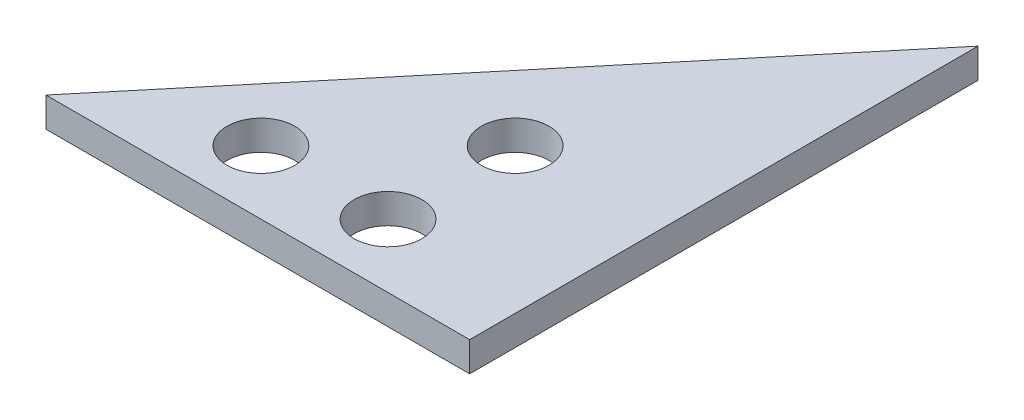
ISO-10303-21;
HEADER;
FILE_DESCRIPTION(('STEP AP214'),'2;1');
FILE_NAME('part.step','',(''),(''),'','','');
FILE_SCHEMA(('AUTOMOTIVE_DESIGN { 1 0 10303 214 1 1 1 1 }'));
ENDSEC;
DATA;
#1=APPLICATION_CONTEXT('core data for automotive mechanical design processes');
#2=APPLICATION_PROTOCOL_DEFINITION('international standard','automotive_design',2000,#1);
#3=PRODUCT_CONTEXT('',#1,'mechanical');
#4=PRODUCT('Part','Part','',(#3));
#5=PRODUCT_RELATED_PRODUCT_CATEGORY('part','',(#4));
#6=PRODUCT_DEFINITION_FORMATION('','',#4);
#7=PRODUCT_DEFINITION_CONTEXT('part definition',#1,'design');
#8=PRODUCT_DEFINITION('design','',#6,#7);
#9=PRODUCT_DEFINITION_SHAPE('','',#8);
#10=(LENGTH_UNIT() NAMED_UNIT(*) SI_UNIT(.MILLI.,.METRE.));
#11=(NAMED_UNIT(*) PLANE_ANGLE_UNIT() SI_UNIT($,.RADIAN.));
#12=(NAMED_UNIT(*) SI_UNIT($,.STERADIAN.) SOLID_ANGLE_UNIT());
#13=UNCERTAINTY_MEASURE_WITH_UNIT(LENGTH_MEASURE(1.E-05),#10,'distance_accuracy_value','');
#14=(GEOMETRIC_REPRESENTATION_CONTEXT(3) GLOBAL_UNCERTAINTY_ASSIGNED_CONTEXT((#13)) GLOBAL_UNIT_ASSIGNED_CONTEXT((#10,
#11,#12)) REPRESENTATION_CONTEXT('',''));
#15=CARTESIAN_POINT('',(0.,0.,0.));
#16=DIRECTION('',(0.,0.,1.));
#17=DIRECTION('',(1.,0.,0.));
#18=AXIS2_PLACEMENT_3D('',#15,#16,#17);
#19=CARTESIAN_POINT('',(47.2347331362598,3.5,-54.3243733430823));
#20=DIRECTION('',(0.768221279597376,0.,0.64018439966448));
#21=DIRECTION('',(0.64018439966448,0.,-0.768221279597376));
#22=AXIS2_PLACEMENT_3D('',#19,#20,#21);
#23=PLANE('',#22);
#24=DIRECTION('',(-0.64018439966448,0.,0.768221279597376));
#25=VECTOR('',#24,1.);
#26=CARTESIAN_POINT('',(47.2347331362598,0.,-54.3243733430823));
#27=LINE('',#26,#25);
#28=CARTESIAN_POINT('',(47.2347331362598,0.,-54.3243733430823));
#29=VERTEX_POINT('',#28);
#30=CARTESIAN_POINT('',(-2.76526686374022,0.,5.6756266569177));
#31=VERTEX_POINT('',#30);
#32=EDGE_CURVE('E84',#29,#31,#27,.T.);
#33=ORIENTED_EDGE('',*,*,#32,.T.);
#34=DIRECTION('',(0.,-1.,0.));
#35=VECTOR('',#34,1.);
#36=CARTESIAN_POINT('',(-2.76526686374022,3.5,5.6756266569177));
#37=LINE('',#36,#35);
#38=CARTESIAN_POINT('',(-2.76526686374022,3.5,5.6756266569177));
#39=VERTEX_POINT('',#38);
#40=EDGE_CURVE('E11',#39,#31,#37,.T.);
#41=ORIENTED_EDGE('',*,*,#40,.F.);
#42=DIRECTION('',(-0.64018439966448,0.,0.768221279597376));
#43=VECTOR('',#42,1.);
#44=CARTESIAN_POINT('',(47.2347331362598,3.5,-54.3243733430823));
#45=LINE('',#44,#43);
#46=CARTESIAN_POINT('',(47.2347331362598,3.5,-54.3243733430823));
#47=VERTEX_POINT('',#46);
#48=EDGE_CURVE('E77',#47,#39,#45,.T.);
#49=ORIENTED_EDGE('',*,*,#48,.F.);
#50=DIRECTION('',(0.,-1.,0.));
#51=VECTOR('',#50,1.);
#52=CARTESIAN_POINT('',(47.2347331362598,3.5,-54.3243733430823));
#53=LINE('',#52,#51);
#54=EDGE_CURVE('E85',#47,#29,#53,.T.);
#55=ORIENTED_EDGE('',*,*,#54,.T.);
#56=EDGE_LOOP('',(#33,#41,#49,#55));
#57=FACE_BOUND('',#56,.T.);
#58=ADVANCED_FACE('F37',(#57),#23,.F.);
#59=CARTESIAN_POINT('',(-2.76526686374022,3.5,5.6756266569177));
#60=DIRECTION('',(0.,0.,-1.));
#61=DIRECTION('',(-1.,0.,0.));
#62=AXIS2_PLACEMENT_3D('',#59,#60,#61);
#63=PLANE('',#62);
#64=DIRECTION('',(1.,0.,0.));
#65=VECTOR('',#64,1.);
#66=CARTESIAN_POINT('',(-2.76526686374022,0.,5.6756266569177));
#67=LINE('',#66,#65);
#68=CARTESIAN_POINT('',(47.2347331362598,0.,5.6756266569177));
#69=VERTEX_POINT('',#68);
#70=EDGE_CURVE('E65',#31,#69,#67,.T.);
#71=ORIENTED_EDGE('',*,*,#70,.T.);
#72=DIRECTION('',(0.,-1.,0.));
#73=VECTOR('',#72,1.);
#74=CARTESIAN_POINT('',(47.2347331362598,3.5,5.6756266569177));
#75=LINE('',#74,#73);
#76=CARTESIAN_POINT('',(47.2347331362598,3.5,5.6756266569177));
#77=VERTEX_POINT('',#76);
#78=EDGE_CURVE('E45',#77,#69,#75,.T.);
#79=ORIENTED_EDGE('',*,*,#78,.F.);
#80=DIRECTION('',(1.,0.,0.));
#81=VECTOR('',#80,1.);
#82=CARTESIAN_POINT('',(-2.76526686374022,3.5,5.6756266569177));
#83=LINE('',#82,#81);
#84=EDGE_CURVE('E73',#39,#77,#83,.T.);
#85=ORIENTED_EDGE('',*,*,#84,.F.);
#86=ORIENTED_EDGE('',*,*,#40,.T.);
#87=EDGE_LOOP('',(#71,#79,#85,#86));
#88=FACE_BOUND('',#87,.T.);
#89=ADVANCED_FACE('F74',(#88),#63,.F.);
#90=CARTESIAN_POINT('',(47.2347331362598,3.5,5.6756266569177));
#91=DIRECTION('',(-1.,0.,0.));
#92=DIRECTION('',(0.,0.,1.));
#93=AXIS2_PLACEMENT_3D('',#90,#91,#92);
#94=PLANE('',#93);
#95=DIRECTION('',(0.,0.,-1.));
#96=VECTOR('',#95,1.);
#97=CARTESIAN_POINT('',(47.2347331362598,0.,5.6756266569177));
#98=LINE('',#97,#96);
#99=EDGE_CURVE('E70',#69,#29,#98,.T.);
#100=ORIENTED_EDGE('',*,*,#99,.T.);
#101=ORIENTED_EDGE('',*,*,#54,.F.);
#102=DIRECTION('',(0.,0.,-1.));
#103=VECTOR('',#102,1.);
#104=CARTESIAN_POINT('',(47.2347331362598,3.5,5.6756266569177));
#105=LINE('',#104,#103);
#106=EDGE_CURVE('E53',#77,#47,#105,.T.);
#107=ORIENTED_EDGE('',*,*,#106,.F.);
#108=ORIENTED_EDGE('',*,*,#78,.T.);
#109=EDGE_LOOP('',(#100,#101,#107,#108));
#110=FACE_BOUND('',#109,.T.);
#111=ADVANCED_FACE('F96',(#110),#94,.F.);
#112=CARTESIAN_POINT('',(0.,3.5,0.));
#113=DIRECTION('',(0.,1.,0.));
#114=DIRECTION('',(0.,0.,1.));
#115=AXIS2_PLACEMENT_3D('',#112,#113,#114);
#116=PLANE('',#115);
#117=CARTESIAN_POINT('',(15.1019731362598,3.5,-1.8243733430823));
#118=DIRECTION('',(0.,1.,0.));
#119=DIRECTION('',(0.,0.,1.));
#120=AXIS2_PLACEMENT_3D('',#117,#118,#119);
#121=CIRCLE('',#120,4.);
#122=CARTESIAN_POINT('',(15.1019731362598,3.5,2.1756266569177));
#123=VERTEX_POINT('',#122);
#124=EDGE_CURVE('E191',#123,#123,#121,.T.);
#125=ORIENTED_EDGE('',*,*,#124,.F.);
#126=EDGE_LOOP('',(#125));
#127=FACE_BOUND('',#126,.T.);
#128=CARTESIAN_POINT('',(30.1019731362598,3.5,-16.8243733430823));
#129=DIRECTION('',(0.,1.,0.));
#130=DIRECTION('',(0.,0.,1.));
#131=AXIS2_PLACEMENT_3D('',#128,#129,#130);
#132=CIRCLE('',#131,4.00000000000001);
#133=CARTESIAN_POINT('',(30.1019731362598,3.5,-12.8243733430823));
#134=VERTEX_POINT('',#133);
#135=EDGE_CURVE('E195',#134,#134,#132,.T.);
#136=ORIENTED_EDGE('',*,*,#135,.F.);
#137=EDGE_LOOP('',(#136));
#138=FACE_BOUND('',#137,.T.);
#139=CARTESIAN_POINT('',(30.1019731362598,3.5,-1.8243733430823));
#140=DIRECTION('',(0.,1.,0.));
#141=DIRECTION('',(0.,0.,1.));
#142=AXIS2_PLACEMENT_3D('',#139,#140,#141);
#143=CIRCLE('',#142,4.00000000000001);
#144=CARTESIAN_POINT('',(30.1019731362598,3.5,2.17562665691771));
#145=VERTEX_POINT('',#144);
#146=EDGE_CURVE('E91',#145,#145,#143,.T.);
#147=ORIENTED_EDGE('',*,*,#146,.F.);
#148=EDGE_LOOP('',(#147));
#149=FACE_BOUND('',#148,.T.);
#150=ORIENTED_EDGE('',*,*,#48,.T.);
#151=ORIENTED_EDGE('',*,*,#84,.T.);
#152=ORIENTED_EDGE('',*,*,#106,.T.);
#153=EDGE_LOOP('',(#150,#151,#152));
#154=FACE_BOUND('',#153,.T.);
#155=ADVANCED_FACE('F80',(#127,#138,#149,#154),#116,.T.);
#156=CARTESIAN_POINT('',(0.,0.,0.));
#157=DIRECTION('',(0.,1.,0.));
#158=DIRECTION('',(0.,0.,1.));
#159=AXIS2_PLACEMENT_3D('',#156,#157,#158);
#160=PLANE('',#159);
#161=CARTESIAN_POINT('',(15.1019731362598,0.,-1.8243733430823));
#162=DIRECTION('',(0.,1.,0.));
#163=DIRECTION('',(0.,0.,1.));
#164=AXIS2_PLACEMENT_3D('',#161,#162,#163);
#165=CIRCLE('',#164,4.);
#166=CARTESIAN_POINT('',(15.1019731362598,0.,2.1756266569177));
#167=VERTEX_POINT('',#166);
#168=EDGE_CURVE('E188',#167,#167,#165,.F.);
#169=ORIENTED_EDGE('',*,*,#168,.F.);
#170=EDGE_LOOP('',(#169));
#171=FACE_BOUND('',#170,.T.);
#172=CARTESIAN_POINT('',(30.1019731362598,0.,-16.8243733430823));
#173=DIRECTION('',(0.,1.,0.));
#174=DIRECTION('',(0.,0.,1.));
#175=AXIS2_PLACEMENT_3D('',#172,#173,#174);
#176=CIRCLE('',#175,4.00000000000001);
#177=CARTESIAN_POINT('',(30.1019731362598,0.,-12.8243733430823));
#178=VERTEX_POINT('',#177);
#179=EDGE_CURVE('E192',#178,#178,#176,.F.);
#180=ORIENTED_EDGE('',*,*,#179,.F.);
#181=EDGE_LOOP('',(#180));
#182=FACE_BOUND('',#181,.T.);
#183=CARTESIAN_POINT('',(30.1019731362598,0.,-1.8243733430823));
#184=DIRECTION('',(0.,1.,0.));
#185=DIRECTION('',(0.,0.,1.));
#186=AXIS2_PLACEMENT_3D('',#183,#184,#185);
#187=CIRCLE('',#186,4.00000000000001);
#188=CARTESIAN_POINT('',(30.1019731362598,0.,2.17562665691771));
#189=VERTEX_POINT('',#188);
#190=EDGE_CURVE('E87',#189,#189,#187,.F.);
#191=ORIENTED_EDGE('',*,*,#190,.F.);
#192=EDGE_LOOP('',(#191));
#193=FACE_BOUND('',#192,.T.);
#194=ORIENTED_EDGE('',*,*,#32,.F.);
#195=ORIENTED_EDGE('',*,*,#99,.F.);
#196=ORIENTED_EDGE('',*,*,#70,.F.);
#197=EDGE_LOOP('',(#194,#195,#196));
#198=FACE_BOUND('',#197,.T.);
#199=ADVANCED_FACE('F97',(#171,#182,#193,#198),#160,.F.);
#200=CARTESIAN_POINT('',(30.1019731362598,-11.3137084989848,-1.8243733430823));
#201=DIRECTION('',(0.,1.,0.));
#202=DIRECTION('',(0.,0.,1.));
#203=AXIS2_PLACEMENT_3D('',#200,#201,#202);
#204=CYLINDRICAL_SURFACE('',#203,4.00000000000001);
#205=ORIENTED_EDGE('',*,*,#190,.T.);
#206=EDGE_LOOP('',(#205));
#207=FACE_BOUND('',#206,.T.);
#208=ORIENTED_EDGE('',*,*,#146,.T.);
#209=EDGE_LOOP('',(#208));
#210=FACE_BOUND('',#209,.T.);
#211=ADVANCED_FACE('F99',(#207,#210),#204,.F.);
#212=CARTESIAN_POINT('',(30.1019731362598,-11.3137084989848,-16.8243733430823));
#213=DIRECTION('',(0.,1.,0.));
#214=DIRECTION('',(0.,0.,1.));
#215=AXIS2_PLACEMENT_3D('',#212,#213,#214);
#216=CYLINDRICAL_SURFACE('',#215,4.00000000000001);
#217=ORIENTED_EDGE('',*,*,#179,.T.);
#218=EDGE_LOOP('',(#217));
#219=FACE_BOUND('',#218,.T.);
#220=ORIENTED_EDGE('',*,*,#135,.T.);
#221=EDGE_LOOP('',(#220));
#222=FACE_BOUND('',#221,.T.);
#223=ADVANCED_FACE('F107',(#219,#222),#216,.F.);
#224=CARTESIAN_POINT('',(15.1019731362598,-11.3137084989848,-1.8243733430823));
#225=DIRECTION('',(0.,1.,0.));
#226=DIRECTION('',(0.,0.,1.));
#227=AXIS2_PLACEMENT_3D('',#224,#225,#226);
#228=CYLINDRICAL_SURFACE('',#227,4.);
#229=ORIENTED_EDGE('',*,*,#168,.T.);
#230=EDGE_LOOP('',(#229));
#231=FACE_BOUND('',#230,.T.);
#232=ORIENTED_EDGE('',*,*,#124,.T.);
#233=EDGE_LOOP('',(#232));
#234=FACE_BOUND('',#233,.T.);
#235=ADVANCED_FACE('F145',(#231,#234),#228,.F.);
#236=CLOSED_SHELL('',(#58,#89,#111,#155,#199,#211,#223,#235));
#237=MANIFOLD_SOLID_BREP('B2',#236);
#238=ADVANCED_BREP_SHAPE_REPRESENTATION('',(#18,#237),#14);
#239=SHAPE_DEFINITION_REPRESENTATION(#9,#238);
ENDSEC;
END-ISO-10303-21;
